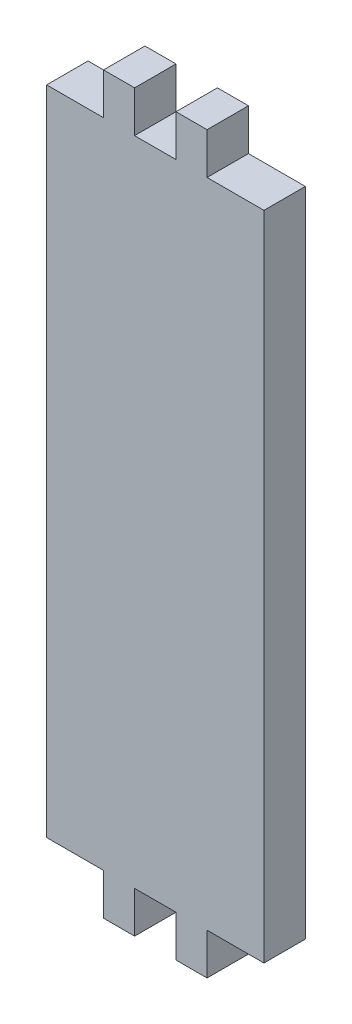
ISO-10303-21;
HEADER;
FILE_DESCRIPTION(('STEP AP214'),'2;1');
FILE_NAME('part.step','',(''),(''),'','','');
FILE_SCHEMA(('AUTOMOTIVE_DESIGN { 1 0 10303 214 1 1 1 1 }'));
ENDSEC;
DATA;
#1=APPLICATION_CONTEXT('core data for automotive mechanical design processes');
#2=APPLICATION_PROTOCOL_DEFINITION('international standard','automotive_design',2000,#1);
#3=PRODUCT_CONTEXT('',#1,'mechanical');
#4=PRODUCT('Part','Part','',(#3));
#5=PRODUCT_RELATED_PRODUCT_CATEGORY('part','',(#4));
#6=PRODUCT_DEFINITION_FORMATION('','',#4);
#7=PRODUCT_DEFINITION_CONTEXT('part definition',#1,'design');
#8=PRODUCT_DEFINITION('design','',#6,#7);
#9=PRODUCT_DEFINITION_SHAPE('','',#8);
#10=(LENGTH_UNIT() NAMED_UNIT(*) SI_UNIT(.MILLI.,.METRE.));
#11=(NAMED_UNIT(*) PLANE_ANGLE_UNIT() SI_UNIT($,.RADIAN.));
#12=(NAMED_UNIT(*) SI_UNIT($,.STERADIAN.) SOLID_ANGLE_UNIT());
#13=UNCERTAINTY_MEASURE_WITH_UNIT(LENGTH_MEASURE(1.E-05),#10,'distance_accuracy_value','');
#14=(GEOMETRIC_REPRESENTATION_CONTEXT(3) GLOBAL_UNCERTAINTY_ASSIGNED_CONTEXT((#13)) GLOBAL_UNIT_ASSIGNED_CONTEXT((#10,
#11,#12)) REPRESENTATION_CONTEXT('',''));
#15=CARTESIAN_POINT('',(0.,0.,0.));
#16=DIRECTION('',(0.,0.,1.));
#17=DIRECTION('',(1.,0.,0.));
#18=AXIS2_PLACEMENT_3D('',#15,#16,#17);
#19=CARTESIAN_POINT('',(-10.0603773584906,-51.760641509434,5.08));
#20=DIRECTION('',(0.,1.,0.));
#21=DIRECTION('',(0.,0.,1.));
#22=AXIS2_PLACEMENT_3D('',#19,#20,#21);
#23=PLANE('',#22);
#24=DIRECTION('',(1.,0.,0.));
#25=VECTOR('',#24,1.);
#26=CARTESIAN_POINT('',(-10.0603773584906,-51.760641509434,5.08));
#27=LINE('',#26,#25);
#28=CARTESIAN_POINT('',(9.61962264150941,-51.760641509434,5.08));
#29=VERTEX_POINT('',#28);
#30=CARTESIAN_POINT('',(16.5996226415094,-51.760641509434,5.08));
#31=VERTEX_POINT('',#30);
#32=EDGE_CURVE('E48',#29,#31,#27,.T.);
#33=ORIENTED_EDGE('',*,*,#32,.F.);
#34=DIRECTION('',(0.,0.,1.));
#35=VECTOR('',#34,1.);
#36=CARTESIAN_POINT('',(9.61962264150941,-51.760641509434,0.));
#37=LINE('',#36,#35);
#38=CARTESIAN_POINT('',(9.61962264150941,-51.760641509434,0.));
#39=VERTEX_POINT('',#38);
#40=EDGE_CURVE('E204',#39,#29,#37,.T.);
#41=ORIENTED_EDGE('',*,*,#40,.F.);
#42=DIRECTION('',(1.,0.,0.));
#43=VECTOR('',#42,1.);
#44=CARTESIAN_POINT('',(-10.0603773584906,-51.760641509434,0.));
#45=LINE('',#44,#43);
#46=CARTESIAN_POINT('',(16.5996226415094,-51.760641509434,0.));
#47=VERTEX_POINT('',#46);
#48=EDGE_CURVE('E306',#39,#47,#45,.T.);
#49=ORIENTED_EDGE('',*,*,#48,.T.);
#50=DIRECTION('',(0.,0.,-1.));
#51=VECTOR('',#50,1.);
#52=CARTESIAN_POINT('',(16.5996226415094,-51.760641509434,5.08));
#53=LINE('',#52,#51);
#54=EDGE_CURVE('E41',#31,#47,#53,.T.);
#55=ORIENTED_EDGE('',*,*,#54,.F.);
#56=EDGE_LOOP('',(#33,#41,#49,#55));
#57=FACE_BOUND('',#56,.T.);
#58=ADVANCED_FACE('F33',(#57),#23,.F.);
#59=CARTESIAN_POINT('',(0.729622641509406,-51.760641509434,0.));
#60=VERTEX_POINT('',#59);
#61=CARTESIAN_POINT('',(5.8096226415094,-51.760641509434,0.));
#62=VERTEX_POINT('',#61);
#63=EDGE_CURVE('E311',#60,#62,#45,.T.);
#64=ORIENTED_EDGE('',*,*,#63,.T.);
#65=DIRECTION('',(0.,0.,1.));
#66=VECTOR('',#65,1.);
#67=CARTESIAN_POINT('',(5.80962264150941,-51.760641509434,0.));
#68=LINE('',#67,#66);
#69=CARTESIAN_POINT('',(5.8096226415094,-51.760641509434,5.08));
#70=VERTEX_POINT('',#69);
#71=EDGE_CURVE('E56',#62,#70,#68,.T.);
#72=ORIENTED_EDGE('',*,*,#71,.T.);
#73=CARTESIAN_POINT('',(0.729622641509406,-51.760641509434,5.08));
#74=VERTEX_POINT('',#73);
#75=EDGE_CURVE('E296',#74,#70,#27,.T.);
#76=ORIENTED_EDGE('',*,*,#75,.F.);
#77=DIRECTION('',(0.,0.,1.));
#78=VECTOR('',#77,1.);
#79=CARTESIAN_POINT('',(0.729622641509406,-51.760641509434,0.));
#80=LINE('',#79,#78);
#81=EDGE_CURVE('E226',#60,#74,#80,.T.);
#82=ORIENTED_EDGE('',*,*,#81,.F.);
#83=EDGE_LOOP('',(#64,#72,#76,#82));
#84=FACE_BOUND('',#83,.T.);
#85=ADVANCED_FACE('F339',(#84),#23,.F.);
#86=CARTESIAN_POINT('',(-10.0603773584906,28.219358490566,5.08));
#87=DIRECTION('',(0.,-1.,0.));
#88=DIRECTION('',(0.,0.,-1.));
#89=AXIS2_PLACEMENT_3D('',#86,#87,#88);
#90=PLANE('',#89);
#91=DIRECTION('',(-1.,0.,0.));
#92=VECTOR('',#91,1.);
#93=CARTESIAN_POINT('',(-10.0603773584906,28.219358490566,0.));
#94=LINE('',#93,#92);
#95=CARTESIAN_POINT('',(5.80962264150941,28.219358490566,0.));
#96=VERTEX_POINT('',#95);
#97=CARTESIAN_POINT('',(0.729622641509406,28.219358490566,0.));
#98=VERTEX_POINT('',#97);
#99=EDGE_CURVE('E316',#96,#98,#94,.T.);
#100=ORIENTED_EDGE('',*,*,#99,.T.);
#101=DIRECTION('',(0.,0.,1.));
#102=VECTOR('',#101,1.);
#103=CARTESIAN_POINT('',(0.729622641509406,28.219358490566,0.));
#104=LINE('',#103,#102);
#105=CARTESIAN_POINT('',(0.729622641509406,28.219358490566,5.08));
#106=VERTEX_POINT('',#105);
#107=EDGE_CURVE('E253',#98,#106,#104,.T.);
#108=ORIENTED_EDGE('',*,*,#107,.T.);
#109=DIRECTION('',(-1.,0.,0.));
#110=VECTOR('',#109,1.);
#111=CARTESIAN_POINT('',(-10.0603773584906,28.219358490566,5.08));
#112=LINE('',#111,#110);
#113=CARTESIAN_POINT('',(5.80962264150941,28.219358490566,5.08));
#114=VERTEX_POINT('',#113);
#115=EDGE_CURVE('E303',#114,#106,#112,.T.);
#116=ORIENTED_EDGE('',*,*,#115,.F.);
#117=DIRECTION('',(0.,0.,1.));
#118=VECTOR('',#117,1.);
#119=CARTESIAN_POINT('',(5.80962264150941,28.219358490566,0.));
#120=LINE('',#119,#118);
#121=EDGE_CURVE('E271',#96,#114,#120,.T.);
#122=ORIENTED_EDGE('',*,*,#121,.F.);
#123=EDGE_LOOP('',(#100,#108,#116,#122));
#124=FACE_BOUND('',#123,.T.);
#125=ADVANCED_FACE('F361',(#124),#90,.F.);
#126=CARTESIAN_POINT('',(-3.08037735849059,28.219358490566,5.08));
#127=VERTEX_POINT('',#126);
#128=CARTESIAN_POINT('',(-10.0603773584906,28.219358490566,5.08));
#129=VERTEX_POINT('',#128);
#130=EDGE_CURVE('E298',#127,#129,#112,.T.);
#131=ORIENTED_EDGE('',*,*,#130,.F.);
#132=DIRECTION('',(0.,0.,1.));
#133=VECTOR('',#132,1.);
#134=CARTESIAN_POINT('',(-3.08037735849059,28.219358490566,0.));
#135=LINE('',#134,#133);
#136=CARTESIAN_POINT('',(-3.08037735849059,28.219358490566,0.));
#137=VERTEX_POINT('',#136);
#138=EDGE_CURVE('E256',#137,#127,#135,.T.);
#139=ORIENTED_EDGE('',*,*,#138,.F.);
#140=CARTESIAN_POINT('',(-10.0603773584906,28.219358490566,0.));
#141=VERTEX_POINT('',#140);
#142=EDGE_CURVE('E313',#137,#141,#94,.T.);
#143=ORIENTED_EDGE('',*,*,#142,.T.);
#144=DIRECTION('',(0.,0.,-1.));
#145=VECTOR('',#144,1.);
#146=CARTESIAN_POINT('',(-10.0603773584906,28.219358490566,5.08));
#147=LINE('',#146,#145);
#148=EDGE_CURVE('E302',#129,#141,#147,.T.);
#149=ORIENTED_EDGE('',*,*,#148,.F.);
#150=EDGE_LOOP('',(#131,#139,#143,#149));
#151=FACE_BOUND('',#150,.T.);
#152=ADVANCED_FACE('F369',(#151),#90,.F.);
#153=CARTESIAN_POINT('',(-10.0603773584906,28.219358490566,5.08));
#154=DIRECTION('',(1.,0.,0.));
#155=DIRECTION('',(0.,1.,0.));
#156=AXIS2_PLACEMENT_3D('',#153,#154,#155);
#157=PLANE('',#156);
#158=DIRECTION('',(0.,-1.,0.));
#159=VECTOR('',#158,1.);
#160=CARTESIAN_POINT('',(-10.0603773584906,28.219358490566,0.));
#161=LINE('',#160,#159);
#162=CARTESIAN_POINT('',(-10.0603773584906,-51.760641509434,0.));
#163=VERTEX_POINT('',#162);
#164=EDGE_CURVE('E281',#141,#163,#161,.T.);
#165=ORIENTED_EDGE('',*,*,#164,.T.);
#166=DIRECTION('',(0.,0.,-1.));
#167=VECTOR('',#166,1.);
#168=CARTESIAN_POINT('',(-10.0603773584906,-51.760641509434,5.08));
#169=LINE('',#168,#167);
#170=CARTESIAN_POINT('',(-10.0603773584906,-51.760641509434,5.08));
#171=VERTEX_POINT('',#170);
#172=EDGE_CURVE('E11',#171,#163,#169,.T.);
#173=ORIENTED_EDGE('',*,*,#172,.F.);
#174=DIRECTION('',(0.,-1.,0.));
#175=VECTOR('',#174,1.);
#176=CARTESIAN_POINT('',(-10.0603773584906,28.219358490566,5.08));
#177=LINE('',#176,#175);
#178=EDGE_CURVE('E288',#129,#171,#177,.T.);
#179=ORIENTED_EDGE('',*,*,#178,.F.);
#180=ORIENTED_EDGE('',*,*,#148,.T.);
#181=EDGE_LOOP('',(#165,#173,#179,#180));
#182=FACE_BOUND('',#181,.T.);
#183=ADVANCED_FACE('F35',(#182),#157,.F.);
#184=CARTESIAN_POINT('',(-3.08037735849059,-51.760641509434,0.));
#185=VERTEX_POINT('',#184);
#186=EDGE_CURVE('E307',#163,#185,#45,.T.);
#187=ORIENTED_EDGE('',*,*,#186,.T.);
#188=DIRECTION('',(0.,0.,1.));
#189=VECTOR('',#188,1.);
#190=CARTESIAN_POINT('',(-3.08037735849059,-51.760641509434,0.));
#191=LINE('',#190,#189);
#192=CARTESIAN_POINT('',(-3.08037735849059,-51.760641509434,5.08));
#193=VERTEX_POINT('',#192);
#194=EDGE_CURVE('E218',#185,#193,#191,.T.);
#195=ORIENTED_EDGE('',*,*,#194,.T.);
#196=EDGE_CURVE('E292',#171,#193,#27,.T.);
#197=ORIENTED_EDGE('',*,*,#196,.F.);
#198=ORIENTED_EDGE('',*,*,#172,.T.);
#199=EDGE_LOOP('',(#187,#195,#197,#198));
#200=FACE_BOUND('',#199,.T.);
#201=ADVANCED_FACE('F357',(#200),#23,.F.);
#202=CARTESIAN_POINT('',(16.5996226415094,28.219358490566,5.08));
#203=DIRECTION('',(-1.,0.,0.));
#204=DIRECTION('',(0.,0.,1.));
#205=AXIS2_PLACEMENT_3D('',#202,#203,#204);
#206=PLANE('',#205);
#207=DIRECTION('',(0.,1.,0.));
#208=VECTOR('',#207,1.);
#209=CARTESIAN_POINT('',(16.5996226415094,28.219358490566,0.));
#210=LINE('',#209,#208);
#211=CARTESIAN_POINT('',(16.5996226415094,28.219358490566,0.));
#212=VERTEX_POINT('',#211);
#213=EDGE_CURVE('E310',#47,#212,#210,.T.);
#214=ORIENTED_EDGE('',*,*,#213,.T.);
#215=DIRECTION('',(0.,0.,-1.));
#216=VECTOR('',#215,1.);
#217=CARTESIAN_POINT('',(16.5996226415094,28.219358490566,5.08));
#218=LINE('',#217,#216);
#219=CARTESIAN_POINT('',(16.5996226415094,28.219358490566,5.08));
#220=VERTEX_POINT('',#219);
#221=EDGE_CURVE('E319',#220,#212,#218,.T.);
#222=ORIENTED_EDGE('',*,*,#221,.F.);
#223=DIRECTION('',(0.,1.,0.));
#224=VECTOR('',#223,1.);
#225=CARTESIAN_POINT('',(16.5996226415094,28.219358490566,5.08));
#226=LINE('',#225,#224);
#227=EDGE_CURVE('E295',#31,#220,#226,.T.);
#228=ORIENTED_EDGE('',*,*,#227,.F.);
#229=ORIENTED_EDGE('',*,*,#54,.T.);
#230=EDGE_LOOP('',(#214,#222,#228,#229));
#231=FACE_BOUND('',#230,.T.);
#232=ADVANCED_FACE('F325',(#231),#206,.F.);
#233=CARTESIAN_POINT('',(9.61962264150941,28.219358490566,0.));
#234=VERTEX_POINT('',#233);
#235=EDGE_CURVE('E291',#212,#234,#94,.T.);
#236=ORIENTED_EDGE('',*,*,#235,.T.);
#237=DIRECTION('',(0.,0.,1.));
#238=VECTOR('',#237,1.);
#239=CARTESIAN_POINT('',(9.61962264150941,28.219358490566,0.));
#240=LINE('',#239,#238);
#241=CARTESIAN_POINT('',(9.61962264150941,28.219358490566,5.08));
#242=VERTEX_POINT('',#241);
#243=EDGE_CURVE('E284',#234,#242,#240,.T.);
#244=ORIENTED_EDGE('',*,*,#243,.T.);
#245=EDGE_CURVE('E299',#220,#242,#112,.T.);
#246=ORIENTED_EDGE('',*,*,#245,.F.);
#247=ORIENTED_EDGE('',*,*,#221,.T.);
#248=EDGE_LOOP('',(#236,#244,#246,#247));
#249=FACE_BOUND('',#248,.T.);
#250=ADVANCED_FACE('F331',(#249),#90,.F.);
#251=CARTESIAN_POINT('',(0.,0.,5.08));
#252=DIRECTION('',(0.,0.,1.));
#253=DIRECTION('',(1.,0.,0.));
#254=AXIS2_PLACEMENT_3D('',#251,#252,#253);
#255=PLANE('',#254);
#256=ORIENTED_EDGE('',*,*,#178,.T.);
#257=ORIENTED_EDGE('',*,*,#196,.T.);
#258=DIRECTION('',(0.,-1.,0.));
#259=VECTOR('',#258,1.);
#260=CARTESIAN_POINT('',(-3.08037735849059,-51.760641509434,5.08));
#261=LINE('',#260,#259);
#262=CARTESIAN_POINT('',(-3.08037735849059,-56.840641509434,5.08));
#263=VERTEX_POINT('',#262);
#264=EDGE_CURVE('E206',#193,#263,#261,.T.);
#265=ORIENTED_EDGE('',*,*,#264,.T.);
#266=DIRECTION('',(1.,0.,0.));
#267=VECTOR('',#266,1.);
#268=CARTESIAN_POINT('',(0.729622641509406,-56.840641509434,5.08));
#269=LINE('',#268,#267);
#270=CARTESIAN_POINT('',(0.729622641509406,-56.840641509434,5.08));
#271=VERTEX_POINT('',#270);
#272=EDGE_CURVE('E221',#263,#271,#269,.T.);
#273=ORIENTED_EDGE('',*,*,#272,.T.);
#274=DIRECTION('',(0.,1.,0.));
#275=VECTOR('',#274,1.);
#276=CARTESIAN_POINT('',(0.729622641509406,-51.760641509434,5.08));
#277=LINE('',#276,#275);
#278=EDGE_CURVE('E213',#271,#74,#277,.T.);
#279=ORIENTED_EDGE('',*,*,#278,.T.);
#280=ORIENTED_EDGE('',*,*,#75,.T.);
#281=DIRECTION('',(0.,-1.,0.));
#282=VECTOR('',#281,1.);
#283=CARTESIAN_POINT('',(5.80962264150941,-51.760641509434,5.08));
#284=LINE('',#283,#282);
#285=CARTESIAN_POINT('',(5.80962264150941,-56.840641509434,5.08));
#286=VERTEX_POINT('',#285);
#287=EDGE_CURVE('E201',#70,#286,#284,.T.);
#288=ORIENTED_EDGE('',*,*,#287,.T.);
#289=DIRECTION('',(1.,0.,0.));
#290=VECTOR('',#289,1.);
#291=CARTESIAN_POINT('',(5.80962264150941,-56.840641509434,5.08));
#292=LINE('',#291,#290);
#293=CARTESIAN_POINT('',(9.61962264150941,-56.840641509434,5.08));
#294=VERTEX_POINT('',#293);
#295=EDGE_CURVE('E178',#286,#294,#292,.T.);
#296=ORIENTED_EDGE('',*,*,#295,.T.);
#297=DIRECTION('',(0.,1.,0.));
#298=VECTOR('',#297,1.);
#299=CARTESIAN_POINT('',(9.61962264150941,-51.760641509434,5.08));
#300=LINE('',#299,#298);
#301=EDGE_CURVE('E195',#294,#29,#300,.T.);
#302=ORIENTED_EDGE('',*,*,#301,.T.);
#303=ORIENTED_EDGE('',*,*,#32,.T.);
#304=ORIENTED_EDGE('',*,*,#227,.T.);
#305=ORIENTED_EDGE('',*,*,#245,.T.);
#306=DIRECTION('',(0.,1.,0.));
#307=VECTOR('',#306,1.);
#308=CARTESIAN_POINT('',(9.61962264150941,28.219358490566,5.08));
#309=LINE('',#308,#307);
#310=CARTESIAN_POINT('',(9.61962264150941,33.299358490566,5.08));
#311=VERTEX_POINT('',#310);
#312=EDGE_CURVE('E274',#242,#311,#309,.T.);
#313=ORIENTED_EDGE('',*,*,#312,.T.);
#314=DIRECTION('',(-1.,0.,0.));
#315=VECTOR('',#314,1.);
#316=CARTESIAN_POINT('',(5.80962264150941,33.299358490566,5.08));
#317=LINE('',#316,#315);
#318=CARTESIAN_POINT('',(5.80962264150941,33.299358490566,5.08));
#319=VERTEX_POINT('',#318);
#320=EDGE_CURVE('E265',#311,#319,#317,.T.);
#321=ORIENTED_EDGE('',*,*,#320,.T.);
#322=DIRECTION('',(0.,-1.,0.));
#323=VECTOR('',#322,1.);
#324=CARTESIAN_POINT('',(5.80962264150941,28.219358490566,5.08));
#325=LINE('',#324,#323);
#326=EDGE_CURVE('E255',#319,#114,#325,.T.);
#327=ORIENTED_EDGE('',*,*,#326,.T.);
#328=ORIENTED_EDGE('',*,*,#115,.T.);
#329=DIRECTION('',(0.,1.,0.));
#330=VECTOR('',#329,1.);
#331=CARTESIAN_POINT('',(0.729622641509406,28.219358490566,5.08));
#332=LINE('',#331,#330);
#333=CARTESIAN_POINT('',(0.729622641509406,33.299358490566,5.08));
#334=VERTEX_POINT('',#333);
#335=EDGE_CURVE('E228',#106,#334,#332,.T.);
#336=ORIENTED_EDGE('',*,*,#335,.T.);
#337=DIRECTION('',(-1.,0.,0.));
#338=VECTOR('',#337,1.);
#339=CARTESIAN_POINT('',(0.729622641509406,33.299358490566,5.08));
#340=LINE('',#339,#338);
#341=CARTESIAN_POINT('',(-3.08037735849059,33.299358490566,5.08));
#342=VERTEX_POINT('',#341);
#343=EDGE_CURVE('E248',#334,#342,#340,.T.);
#344=ORIENTED_EDGE('',*,*,#343,.T.);
#345=DIRECTION('',(0.,-1.,0.));
#346=VECTOR('',#345,1.);
#347=CARTESIAN_POINT('',(-3.08037735849059,28.219358490566,5.08));
#348=LINE('',#347,#346);
#349=EDGE_CURVE('E239',#342,#127,#348,.T.);
#350=ORIENTED_EDGE('',*,*,#349,.T.);
#351=ORIENTED_EDGE('',*,*,#130,.T.);
#352=EDGE_LOOP('',(#256,#257,#265,#273,#279,#280,#288,#296,#302,#303,#304,#305,#313,#321,#327,
#328,#336,#344,#350,#351));
#353=FACE_BOUND('',#352,.T.);
#354=ADVANCED_FACE('F334',(#353),#255,.T.);
#355=CARTESIAN_POINT('',(0.,0.,0.));
#356=DIRECTION('',(0.,0.,1.));
#357=DIRECTION('',(1.,0.,0.));
#358=AXIS2_PLACEMENT_3D('',#355,#356,#357);
#359=PLANE('',#358);
#360=ORIENTED_EDGE('',*,*,#164,.F.);
#361=ORIENTED_EDGE('',*,*,#142,.F.);
#362=DIRECTION('',(0.,-1.,0.));
#363=VECTOR('',#362,1.);
#364=CARTESIAN_POINT('',(-3.08037735849059,28.219358490566,0.));
#365=LINE('',#364,#363);
#366=CARTESIAN_POINT('',(-3.08037735849059,33.299358490566,0.));
#367=VERTEX_POINT('',#366);
#368=EDGE_CURVE('E242',#367,#137,#365,.T.);
#369=ORIENTED_EDGE('',*,*,#368,.F.);
#370=DIRECTION('',(-1.,0.,0.));
#371=VECTOR('',#370,1.);
#372=CARTESIAN_POINT('',(0.729622641509406,33.299358490566,0.));
#373=LINE('',#372,#371);
#374=CARTESIAN_POINT('',(0.729622641509406,33.299358490566,0.));
#375=VERTEX_POINT('',#374);
#376=EDGE_CURVE('E238',#375,#367,#373,.T.);
#377=ORIENTED_EDGE('',*,*,#376,.F.);
#378=DIRECTION('',(0.,1.,0.));
#379=VECTOR('',#378,1.);
#380=CARTESIAN_POINT('',(0.729622641509406,28.219358490566,0.));
#381=LINE('',#380,#379);
#382=EDGE_CURVE('E235',#98,#375,#381,.T.);
#383=ORIENTED_EDGE('',*,*,#382,.F.);
#384=ORIENTED_EDGE('',*,*,#99,.F.);
#385=DIRECTION('',(0.,-1.,0.));
#386=VECTOR('',#385,1.);
#387=CARTESIAN_POINT('',(5.80962264150941,28.219358490566,0.));
#388=LINE('',#387,#386);
#389=CARTESIAN_POINT('',(5.80962264150941,33.299358490566,0.));
#390=VERTEX_POINT('',#389);
#391=EDGE_CURVE('E262',#390,#96,#388,.T.);
#392=ORIENTED_EDGE('',*,*,#391,.F.);
#393=DIRECTION('',(-1.,0.,0.));
#394=VECTOR('',#393,1.);
#395=CARTESIAN_POINT('',(5.80962264150941,33.299358490566,0.));
#396=LINE('',#395,#394);
#397=CARTESIAN_POINT('',(9.61962264150941,33.299358490566,0.));
#398=VERTEX_POINT('',#397);
#399=EDGE_CURVE('E268',#398,#390,#396,.T.);
#400=ORIENTED_EDGE('',*,*,#399,.F.);
#401=DIRECTION('',(0.,1.,0.));
#402=VECTOR('',#401,1.);
#403=CARTESIAN_POINT('',(9.61962264150941,28.219358490566,0.));
#404=LINE('',#403,#402);
#405=EDGE_CURVE('E264',#234,#398,#404,.T.);
#406=ORIENTED_EDGE('',*,*,#405,.F.);
#407=ORIENTED_EDGE('',*,*,#235,.F.);
#408=ORIENTED_EDGE('',*,*,#213,.F.);
#409=ORIENTED_EDGE('',*,*,#48,.F.);
#410=DIRECTION('',(0.,1.,0.));
#411=VECTOR('',#410,1.);
#412=CARTESIAN_POINT('',(9.61962264150941,-51.760641509434,0.));
#413=LINE('',#412,#411);
#414=CARTESIAN_POINT('',(9.61962264150941,-56.840641509434,0.));
#415=VERTEX_POINT('',#414);
#416=EDGE_CURVE('E192',#415,#39,#413,.T.);
#417=ORIENTED_EDGE('',*,*,#416,.F.);
#418=DIRECTION('',(1.,0.,0.));
#419=VECTOR('',#418,1.);
#420=CARTESIAN_POINT('',(5.80962264150941,-56.840641509434,0.));
#421=LINE('',#420,#419);
#422=CARTESIAN_POINT('',(5.80962264150941,-56.840641509434,0.));
#423=VERTEX_POINT('',#422);
#424=EDGE_CURVE('E175',#423,#415,#421,.T.);
#425=ORIENTED_EDGE('',*,*,#424,.F.);
#426=DIRECTION('',(0.,-1.,0.));
#427=VECTOR('',#426,1.);
#428=CARTESIAN_POINT('',(5.80962264150941,-51.760641509434,0.));
#429=LINE('',#428,#427);
#430=EDGE_CURVE('E190',#62,#423,#429,.T.);
#431=ORIENTED_EDGE('',*,*,#430,.F.);
#432=ORIENTED_EDGE('',*,*,#63,.F.);
#433=DIRECTION('',(0.,1.,0.));
#434=VECTOR('',#433,1.);
#435=CARTESIAN_POINT('',(0.729622641509406,-51.760641509434,0.));
#436=LINE('',#435,#434);
#437=CARTESIAN_POINT('',(0.729622641509406,-56.840641509434,0.));
#438=VERTEX_POINT('',#437);
#439=EDGE_CURVE('E216',#438,#60,#436,.T.);
#440=ORIENTED_EDGE('',*,*,#439,.F.);
#441=DIRECTION('',(1.,0.,0.));
#442=VECTOR('',#441,1.);
#443=CARTESIAN_POINT('',(0.729622641509406,-56.840641509434,0.));
#444=LINE('',#443,#442);
#445=CARTESIAN_POINT('',(-3.08037735849059,-56.840641509434,0.));
#446=VERTEX_POINT('',#445);
#447=EDGE_CURVE('E212',#446,#438,#444,.T.);
#448=ORIENTED_EDGE('',*,*,#447,.F.);
#449=DIRECTION('',(0.,-1.,0.));
#450=VECTOR('',#449,1.);
#451=CARTESIAN_POINT('',(-3.08037735849059,-51.760641509434,0.));
#452=LINE('',#451,#450);
#453=EDGE_CURVE('E209',#185,#446,#452,.T.);
#454=ORIENTED_EDGE('',*,*,#453,.F.);
#455=ORIENTED_EDGE('',*,*,#186,.F.);
#456=EDGE_LOOP('',(#360,#361,#369,#377,#383,#384,#392,#400,#406,#407,#408,#409,#417,#425,#431,
#432,#440,#448,#454,#455));
#457=FACE_BOUND('',#456,.T.);
#458=ADVANCED_FACE('F188',(#457),#359,.F.);
#459=CARTESIAN_POINT('',(5.80962264150941,28.219358490566,0.));
#460=DIRECTION('',(-1.,0.,0.));
#461=DIRECTION('',(0.,0.,1.));
#462=AXIS2_PLACEMENT_3D('',#459,#460,#461);
#463=PLANE('',#462);
#464=ORIENTED_EDGE('',*,*,#326,.F.);
#465=DIRECTION('',(0.,0.,1.));
#466=VECTOR('',#465,1.);
#467=CARTESIAN_POINT('',(5.80962264150941,33.299358490566,0.));
#468=LINE('',#467,#466);
#469=EDGE_CURVE('E279',#390,#319,#468,.T.);
#470=ORIENTED_EDGE('',*,*,#469,.F.);
#471=ORIENTED_EDGE('',*,*,#391,.T.);
#472=ORIENTED_EDGE('',*,*,#121,.T.);
#473=EDGE_LOOP('',(#464,#470,#471,#472));
#474=FACE_BOUND('',#473,.T.);
#475=ADVANCED_FACE('F397',(#474),#463,.T.);
#476=CARTESIAN_POINT('',(5.80962264150941,33.299358490566,0.));
#477=DIRECTION('',(0.,1.,0.));
#478=DIRECTION('',(0.,0.,1.));
#479=AXIS2_PLACEMENT_3D('',#476,#477,#478);
#480=PLANE('',#479);
#481=ORIENTED_EDGE('',*,*,#320,.F.);
#482=DIRECTION('',(0.,0.,1.));
#483=VECTOR('',#482,1.);
#484=CARTESIAN_POINT('',(9.61962264150941,33.299358490566,0.));
#485=LINE('',#484,#483);
#486=EDGE_CURVE('E282',#398,#311,#485,.T.);
#487=ORIENTED_EDGE('',*,*,#486,.F.);
#488=ORIENTED_EDGE('',*,*,#399,.T.);
#489=ORIENTED_EDGE('',*,*,#469,.T.);
#490=EDGE_LOOP('',(#481,#487,#488,#489));
#491=FACE_BOUND('',#490,.T.);
#492=ADVANCED_FACE('F399',(#491),#480,.T.);
#493=CARTESIAN_POINT('',(9.61962264150941,28.219358490566,0.));
#494=DIRECTION('',(1.,0.,0.));
#495=DIRECTION('',(0.,0.,-1.));
#496=AXIS2_PLACEMENT_3D('',#493,#494,#495);
#497=PLANE('',#496);
#498=ORIENTED_EDGE('',*,*,#312,.F.);
#499=ORIENTED_EDGE('',*,*,#243,.F.);
#500=ORIENTED_EDGE('',*,*,#405,.T.);
#501=ORIENTED_EDGE('',*,*,#486,.T.);
#502=EDGE_LOOP('',(#498,#499,#500,#501));
#503=FACE_BOUND('',#502,.T.);
#504=ADVANCED_FACE('F401',(#503),#497,.T.);
#505=CARTESIAN_POINT('',(0.729622641509406,28.219358490566,0.));
#506=DIRECTION('',(1.,0.,0.));
#507=DIRECTION('',(0.,0.,-1.));
#508=AXIS2_PLACEMENT_3D('',#505,#506,#507);
#509=PLANE('',#508);
#510=ORIENTED_EDGE('',*,*,#335,.F.);
#511=ORIENTED_EDGE('',*,*,#107,.F.);
#512=ORIENTED_EDGE('',*,*,#382,.T.);
#513=DIRECTION('',(0.,0.,1.));
#514=VECTOR('',#513,1.);
#515=CARTESIAN_POINT('',(0.729622641509406,33.299358490566,0.));
#516=LINE('',#515,#514);
#517=EDGE_CURVE('E245',#375,#334,#516,.T.);
#518=ORIENTED_EDGE('',*,*,#517,.T.);
#519=EDGE_LOOP('',(#510,#511,#512,#518));
#520=FACE_BOUND('',#519,.T.);
#521=ADVANCED_FACE('F389',(#520),#509,.T.);
#522=CARTESIAN_POINT('',(-3.08037735849059,28.219358490566,0.));
#523=DIRECTION('',(-1.,0.,0.));
#524=DIRECTION('',(0.,0.,1.));
#525=AXIS2_PLACEMENT_3D('',#522,#523,#524);
#526=PLANE('',#525);
#527=ORIENTED_EDGE('',*,*,#349,.F.);
#528=DIRECTION('',(0.,0.,1.));
#529=VECTOR('',#528,1.);
#530=CARTESIAN_POINT('',(-3.08037735849059,33.299358490566,0.));
#531=LINE('',#530,#529);
#532=EDGE_CURVE('E259',#367,#342,#531,.T.);
#533=ORIENTED_EDGE('',*,*,#532,.F.);
#534=ORIENTED_EDGE('',*,*,#368,.T.);
#535=ORIENTED_EDGE('',*,*,#138,.T.);
#536=EDGE_LOOP('',(#527,#533,#534,#535));
#537=FACE_BOUND('',#536,.T.);
#538=ADVANCED_FACE('F408',(#537),#526,.T.);
#539=CARTESIAN_POINT('',(0.729622641509406,33.299358490566,0.));
#540=DIRECTION('',(0.,1.,0.));
#541=DIRECTION('',(0.,0.,1.));
#542=AXIS2_PLACEMENT_3D('',#539,#540,#541);
#543=PLANE('',#542);
#544=ORIENTED_EDGE('',*,*,#343,.F.);
#545=ORIENTED_EDGE('',*,*,#517,.F.);
#546=ORIENTED_EDGE('',*,*,#376,.T.);
#547=ORIENTED_EDGE('',*,*,#532,.T.);
#548=EDGE_LOOP('',(#544,#545,#546,#547));
#549=FACE_BOUND('',#548,.T.);
#550=ADVANCED_FACE('F393',(#549),#543,.T.);
#551=CARTESIAN_POINT('',(0.729622641509406,-51.760641509434,0.));
#552=DIRECTION('',(1.,0.,0.));
#553=DIRECTION('',(0.,0.,-1.));
#554=AXIS2_PLACEMENT_3D('',#551,#552,#553);
#555=PLANE('',#554);
#556=ORIENTED_EDGE('',*,*,#278,.F.);
#557=DIRECTION('',(0.,0.,1.));
#558=VECTOR('',#557,1.);
#559=CARTESIAN_POINT('',(0.729622641509406,-56.840641509434,0.));
#560=LINE('',#559,#558);
#561=EDGE_CURVE('E229',#438,#271,#560,.T.);
#562=ORIENTED_EDGE('',*,*,#561,.F.);
#563=ORIENTED_EDGE('',*,*,#439,.T.);
#564=ORIENTED_EDGE('',*,*,#81,.T.);
#565=EDGE_LOOP('',(#556,#562,#563,#564));
#566=FACE_BOUND('',#565,.T.);
#567=ADVANCED_FACE('F527',(#566),#555,.T.);
#568=CARTESIAN_POINT('',(0.729622641509406,-56.840641509434,0.));
#569=DIRECTION('',(0.,-1.,0.));
#570=DIRECTION('',(0.,0.,-1.));
#571=AXIS2_PLACEMENT_3D('',#568,#569,#570);
#572=PLANE('',#571);
#573=ORIENTED_EDGE('',*,*,#272,.F.);
#574=DIRECTION('',(0.,0.,1.));
#575=VECTOR('',#574,1.);
#576=CARTESIAN_POINT('',(-3.08037735849059,-56.840641509434,0.));
#577=LINE('',#576,#575);
#578=EDGE_CURVE('E231',#446,#263,#577,.T.);
#579=ORIENTED_EDGE('',*,*,#578,.F.);
#580=ORIENTED_EDGE('',*,*,#447,.T.);
#581=ORIENTED_EDGE('',*,*,#561,.T.);
#582=EDGE_LOOP('',(#573,#579,#580,#581));
#583=FACE_BOUND('',#582,.T.);
#584=ADVANCED_FACE('F353',(#583),#572,.T.);
#585=CARTESIAN_POINT('',(-3.08037735849059,-51.760641509434,0.));
#586=DIRECTION('',(-1.,0.,0.));
#587=DIRECTION('',(0.,0.,1.));
#588=AXIS2_PLACEMENT_3D('',#585,#586,#587);
#589=PLANE('',#588);
#590=ORIENTED_EDGE('',*,*,#264,.F.);
#591=ORIENTED_EDGE('',*,*,#194,.F.);
#592=ORIENTED_EDGE('',*,*,#453,.T.);
#593=ORIENTED_EDGE('',*,*,#578,.T.);
#594=EDGE_LOOP('',(#590,#591,#592,#593));
#595=FACE_BOUND('',#594,.T.);
#596=ADVANCED_FACE('F346',(#595),#589,.T.);
#597=CARTESIAN_POINT('',(9.61962264150941,-51.760641509434,0.));
#598=DIRECTION('',(1.,0.,0.));
#599=DIRECTION('',(0.,0.,-1.));
#600=AXIS2_PLACEMENT_3D('',#597,#598,#599);
#601=PLANE('',#600);
#602=ORIENTED_EDGE('',*,*,#301,.F.);
#603=DIRECTION('',(0.,0.,1.));
#604=VECTOR('',#603,1.);
#605=CARTESIAN_POINT('',(9.61962264150941,-56.840641509434,0.));
#606=LINE('',#605,#604);
#607=EDGE_CURVE('E183',#415,#294,#606,.T.);
#608=ORIENTED_EDGE('',*,*,#607,.F.);
#609=ORIENTED_EDGE('',*,*,#416,.T.);
#610=ORIENTED_EDGE('',*,*,#40,.T.);
#611=EDGE_LOOP('',(#602,#608,#609,#610));
#612=FACE_BOUND('',#611,.T.);
#613=ADVANCED_FACE('F344',(#612),#601,.T.);
#614=CARTESIAN_POINT('',(5.80962264150941,-56.840641509434,0.));
#615=DIRECTION('',(0.,-1.,0.));
#616=DIRECTION('',(0.,0.,-1.));
#617=AXIS2_PLACEMENT_3D('',#614,#615,#616);
#618=PLANE('',#617);
#619=ORIENTED_EDGE('',*,*,#295,.F.);
#620=DIRECTION('',(0.,0.,1.));
#621=VECTOR('',#620,1.);
#622=CARTESIAN_POINT('',(5.80962264150941,-56.840641509434,0.));
#623=LINE('',#622,#621);
#624=EDGE_CURVE('E172',#423,#286,#623,.T.);
#625=ORIENTED_EDGE('',*,*,#624,.F.);
#626=ORIENTED_EDGE('',*,*,#424,.T.);
#627=ORIENTED_EDGE('',*,*,#607,.T.);
#628=EDGE_LOOP('',(#619,#625,#626,#627));
#629=FACE_BOUND('',#628,.T.);
#630=ADVANCED_FACE('F174',(#629),#618,.T.);
#631=CARTESIAN_POINT('',(5.80962264150941,-51.760641509434,0.));
#632=DIRECTION('',(-1.,0.,0.));
#633=DIRECTION('',(0.,0.,1.));
#634=AXIS2_PLACEMENT_3D('',#631,#632,#633);
#635=PLANE('',#634);
#636=ORIENTED_EDGE('',*,*,#287,.F.);
#637=ORIENTED_EDGE('',*,*,#71,.F.);
#638=ORIENTED_EDGE('',*,*,#430,.T.);
#639=ORIENTED_EDGE('',*,*,#624,.T.);
#640=EDGE_LOOP('',(#636,#637,#638,#639));
#641=FACE_BOUND('',#640,.T.);
#642=ADVANCED_FACE('F194',(#641),#635,.T.);
#643=CLOSED_SHELL('',(#58,#85,#125,#152,#183,#201,#232,#250,#354,#458,#475,#492,#504,#521,#538,
#550,#567,#584,#596,#613,#630,#642));
#644=MANIFOLD_SOLID_BREP('B2',#643);
#645=ADVANCED_BREP_SHAPE_REPRESENTATION('',(#18,#644),#14);
#646=SHAPE_DEFINITION_REPRESENTATION(#9,#645);
ENDSEC;
END-ISO-10303-21;
